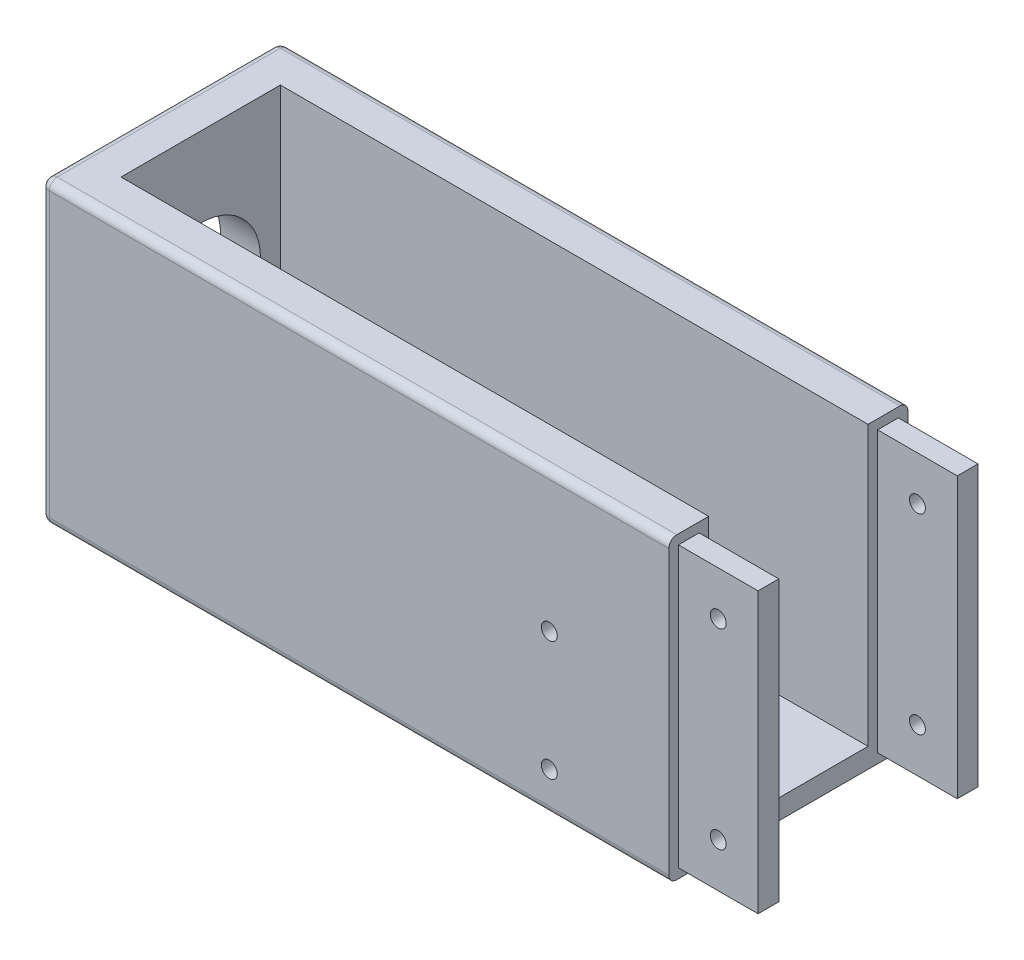
ISO-10303-21;
HEADER;
FILE_DESCRIPTION(('STEP AP214'),'2;1');
FILE_NAME('part.step','',(''),(''),'','','');
FILE_SCHEMA(('AUTOMOTIVE_DESIGN { 1 0 10303 214 1 1 1 1 }'));
ENDSEC;
DATA;
#1=APPLICATION_CONTEXT('core data for automotive mechanical design processes');
#2=APPLICATION_PROTOCOL_DEFINITION('international standard','automotive_design',2000,#1);
#3=PRODUCT_CONTEXT('',#1,'mechanical');
#4=PRODUCT('Part','Part','',(#3));
#5=PRODUCT_RELATED_PRODUCT_CATEGORY('part','',(#4));
#6=PRODUCT_DEFINITION_FORMATION('','',#4);
#7=PRODUCT_DEFINITION_CONTEXT('part definition',#1,'design');
#8=PRODUCT_DEFINITION('design','',#6,#7);
#9=PRODUCT_DEFINITION_SHAPE('','',#8);
#10=(LENGTH_UNIT() NAMED_UNIT(*) SI_UNIT(.MILLI.,.METRE.));
#11=(NAMED_UNIT(*) PLANE_ANGLE_UNIT() SI_UNIT($,.RADIAN.));
#12=(NAMED_UNIT(*) SI_UNIT($,.STERADIAN.) SOLID_ANGLE_UNIT());
#13=UNCERTAINTY_MEASURE_WITH_UNIT(LENGTH_MEASURE(1.E-05),#10,'distance_accuracy_value','');
#14=(GEOMETRIC_REPRESENTATION_CONTEXT(3) GLOBAL_UNCERTAINTY_ASSIGNED_CONTEXT((#13)) GLOBAL_UNIT_ASSIGNED_CONTEXT((#10,
#11,#12)) REPRESENTATION_CONTEXT('',''));
#15=CARTESIAN_POINT('',(0.,0.,0.));
#16=DIRECTION('',(0.,0.,1.));
#17=DIRECTION('',(1.,0.,0.));
#18=AXIS2_PLACEMENT_3D('',#15,#16,#17);
#19=CARTESIAN_POINT('',(0.,0.,0.));
#20=DIRECTION('',(1.,0.,0.));
#21=DIRECTION('',(0.,0.,-1.));
#22=AXIS2_PLACEMENT_3D('',#19,#20,#21);
#23=PLANE('',#22);
#24=DIRECTION('',(0.,1.,0.));
#25=VECTOR('',#24,1.);
#26=CARTESIAN_POINT('',(0.,2.4,-27.6));
#27=LINE('',#26,#25);
#28=CARTESIAN_POINT('',(0.,2.4,-27.6));
#29=VERTEX_POINT('',#28);
#30=CARTESIAN_POINT('',(0.,72.6,-27.6));
#31=VERTEX_POINT('',#30);
#32=EDGE_CURVE('E60',#29,#31,#27,.T.);
#33=ORIENTED_EDGE('',*,*,#32,.F.);
#34=DIRECTION('',(0.,0.,-1.));
#35=VECTOR('',#34,1.);
#36=CARTESIAN_POINT('',(0.,2.4,-22.4));
#37=LINE('',#36,#35);
#38=CARTESIAN_POINT('',(0.,2.4,-22.4));
#39=VERTEX_POINT('',#38);
#40=EDGE_CURVE('E64',#39,#29,#37,.T.);
#41=ORIENTED_EDGE('',*,*,#40,.F.);
#42=DIRECTION('',(0.,-1.,0.));
#43=VECTOR('',#42,1.);
#44=CARTESIAN_POINT('',(0.,72.6,-22.4));
#45=LINE('',#44,#43);
#46=CARTESIAN_POINT('',(0.,72.6,-22.4));
#47=VERTEX_POINT('',#46);
#48=EDGE_CURVE('E394',#47,#39,#45,.T.);
#49=ORIENTED_EDGE('',*,*,#48,.F.);
#50=DIRECTION('',(0.,0.,1.));
#51=VECTOR('',#50,1.);
#52=CARTESIAN_POINT('',(0.,72.6,-27.6));
#53=LINE('',#52,#51);
#54=EDGE_CURVE('E392',#31,#47,#53,.T.);
#55=ORIENTED_EDGE('',*,*,#54,.F.);
#56=EDGE_LOOP('',(#33,#41,#49,#55));
#57=FACE_BOUND('',#56,.T.);
#58=CARTESIAN_POINT('',(0.,73.,-28.));
#59=DIRECTION('',(1.,0.,0.));
#60=DIRECTION('',(0.,0.,-1.));
#61=AXIS2_PLACEMENT_3D('',#58,#59,#60);
#62=CIRCLE('',#61,2.);
#63=CARTESIAN_POINT('',(0.,75.,-28.));
#64=VERTEX_POINT('',#63);
#65=CARTESIAN_POINT('',(0.,73.,-30.));
#66=VERTEX_POINT('',#65);
#67=EDGE_CURVE('E326',#64,#66,#62,.F.);
#68=ORIENTED_EDGE('',*,*,#67,.F.);
#69=DIRECTION('',(0.,0.,1.));
#70=VECTOR('',#69,1.);
#71=CARTESIAN_POINT('',(0.,75.,0.));
#72=LINE('',#71,#70);
#73=CARTESIAN_POINT('',(0.,75.,-20.));
#74=VERTEX_POINT('',#73);
#75=EDGE_CURVE('E341',#64,#74,#72,.T.);
#76=ORIENTED_EDGE('',*,*,#75,.T.);
#77=DIRECTION('',(0.,-1.,0.));
#78=VECTOR('',#77,1.);
#79=CARTESIAN_POINT('',(0.,4.99999999999999,-20.));
#80=LINE('',#79,#78);
#81=CARTESIAN_POINT('',(0.,4.99999999999999,-20.));
#82=VERTEX_POINT('',#81);
#83=EDGE_CURVE('E214',#74,#82,#80,.T.);
#84=ORIENTED_EDGE('',*,*,#83,.T.);
#85=DIRECTION('',(0.,0.,-1.));
#86=VECTOR('',#85,1.);
#87=CARTESIAN_POINT('',(0.,4.99999999999999,0.));
#88=LINE('',#87,#86);
#89=CARTESIAN_POINT('',(0.,4.99999999999999,20.));
#90=VERTEX_POINT('',#89);
#91=EDGE_CURVE('E330',#90,#82,#88,.T.);
#92=ORIENTED_EDGE('',*,*,#91,.F.);
#93=DIRECTION('',(0.,1.,0.));
#94=VECTOR('',#93,1.);
#95=CARTESIAN_POINT('',(0.,4.99999999999999,20.));
#96=LINE('',#95,#94);
#97=CARTESIAN_POINT('',(0.,75.,20.));
#98=VERTEX_POINT('',#97);
#99=EDGE_CURVE('E217',#90,#98,#96,.T.);
#100=ORIENTED_EDGE('',*,*,#99,.T.);
#101=CARTESIAN_POINT('',(0.,75.,28.));
#102=VERTEX_POINT('',#101);
#103=EDGE_CURVE('E342',#98,#102,#72,.T.);
#104=ORIENTED_EDGE('',*,*,#103,.T.);
#105=CARTESIAN_POINT('',(0.,73.,28.));
#106=DIRECTION('',(1.,0.,0.));
#107=DIRECTION('',(0.,0.,-1.));
#108=AXIS2_PLACEMENT_3D('',#105,#106,#107);
#109=CIRCLE('',#108,2.);
#110=CARTESIAN_POINT('',(0.,73.,30.));
#111=VERTEX_POINT('',#110);
#112=EDGE_CURVE('E275',#111,#102,#109,.F.);
#113=ORIENTED_EDGE('',*,*,#112,.F.);
#114=DIRECTION('',(0.,-1.,0.));
#115=VECTOR('',#114,1.);
#116=CARTESIAN_POINT('',(0.,75.,30.));
#117=LINE('',#116,#115);
#118=CARTESIAN_POINT('',(0.,2.,30.));
#119=VERTEX_POINT('',#118);
#120=EDGE_CURVE('E335',#111,#119,#117,.T.);
#121=ORIENTED_EDGE('',*,*,#120,.T.);
#122=CARTESIAN_POINT('',(0.,2.,28.));
#123=DIRECTION('',(1.,0.,0.));
#124=DIRECTION('',(0.,0.,-1.));
#125=AXIS2_PLACEMENT_3D('',#122,#123,#124);
#126=CIRCLE('',#125,2.);
#127=CARTESIAN_POINT('',(0.,0.,28.));
#128=VERTEX_POINT('',#127);
#129=EDGE_CURVE('E324',#128,#119,#126,.F.);
#130=ORIENTED_EDGE('',*,*,#129,.F.);
#131=DIRECTION('',(0.,0.,1.));
#132=VECTOR('',#131,1.);
#133=CARTESIAN_POINT('',(0.,0.,0.));
#134=LINE('',#133,#132);
#135=CARTESIAN_POINT('',(0.,0.,-28.));
#136=VERTEX_POINT('',#135);
#137=EDGE_CURVE('E332',#136,#128,#134,.T.);
#138=ORIENTED_EDGE('',*,*,#137,.F.);
#139=CARTESIAN_POINT('',(0.,2.,-28.));
#140=DIRECTION('',(1.,0.,0.));
#141=DIRECTION('',(0.,0.,-1.));
#142=AXIS2_PLACEMENT_3D('',#139,#140,#141);
#143=CIRCLE('',#142,2.);
#144=CARTESIAN_POINT('',(0.,2.,-30.));
#145=VERTEX_POINT('',#144);
#146=EDGE_CURVE('E328',#145,#136,#143,.F.);
#147=ORIENTED_EDGE('',*,*,#146,.F.);
#148=DIRECTION('',(0.,1.,0.));
#149=VECTOR('',#148,1.);
#150=CARTESIAN_POINT('',(0.,75.,-30.));
#151=LINE('',#150,#149);
#152=EDGE_CURVE('E338',#145,#66,#151,.T.);
#153=ORIENTED_EDGE('',*,*,#152,.T.);
#154=EDGE_LOOP('',(#68,#76,#84,#92,#100,#104,#113,#121,#130,#138,#147,#153));
#155=FACE_BOUND('',#154,.T.);
#156=DIRECTION('',(0.,0.,1.));
#157=VECTOR('',#156,1.);
#158=CARTESIAN_POINT('',(0.,72.6,22.4));
#159=LINE('',#158,#157);
#160=CARTESIAN_POINT('',(0.,72.6,22.4));
#161=VERTEX_POINT('',#160);
#162=CARTESIAN_POINT('',(0.,72.6,27.6));
#163=VERTEX_POINT('',#162);
#164=EDGE_CURVE('E241',#161,#163,#159,.T.);
#165=ORIENTED_EDGE('',*,*,#164,.F.);
#166=DIRECTION('',(0.,1.,0.));
#167=VECTOR('',#166,1.);
#168=CARTESIAN_POINT('',(0.,2.4,22.4));
#169=LINE('',#168,#167);
#170=CARTESIAN_POINT('',(0.,2.4,22.4));
#171=VERTEX_POINT('',#170);
#172=EDGE_CURVE('E243',#171,#161,#169,.T.);
#173=ORIENTED_EDGE('',*,*,#172,.F.);
#174=DIRECTION('',(0.,0.,-1.));
#175=VECTOR('',#174,1.);
#176=CARTESIAN_POINT('',(0.,2.4,27.6));
#177=LINE('',#176,#175);
#178=CARTESIAN_POINT('',(0.,2.4,27.6));
#179=VERTEX_POINT('',#178);
#180=EDGE_CURVE('E235',#179,#171,#177,.T.);
#181=ORIENTED_EDGE('',*,*,#180,.F.);
#182=DIRECTION('',(0.,-1.,0.));
#183=VECTOR('',#182,1.);
#184=CARTESIAN_POINT('',(0.,72.6,27.6));
#185=LINE('',#184,#183);
#186=EDGE_CURVE('E237',#163,#179,#185,.T.);
#187=ORIENTED_EDGE('',*,*,#186,.F.);
#188=EDGE_LOOP('',(#165,#173,#181,#187));
#189=FACE_BOUND('',#188,.T.);
#190=ADVANCED_FACE('F43',(#57,#155,#189),#23,.T.);
#191=CARTESIAN_POINT('',(-157.5,75.,-30.));
#192=DIRECTION('',(1.,0.,0.));
#193=DIRECTION('',(0.,0.,-1.));
#194=AXIS2_PLACEMENT_3D('',#191,#192,#193);
#195=PLANE('',#194);
#196=CARTESIAN_POINT('',(-157.5,40.,0.));
#197=DIRECTION('',(1.,0.,0.));
#198=DIRECTION('',(0.,0.,-1.));
#199=AXIS2_PLACEMENT_3D('',#196,#197,#198);
#200=CIRCLE('',#199,15.);
#201=CARTESIAN_POINT('',(-157.5,40.,-14.9999999999999));
#202=VERTEX_POINT('',#201);
#203=EDGE_CURVE('E909',#202,#202,#200,.T.);
#204=ORIENTED_EDGE('',*,*,#203,.T.);
#205=EDGE_LOOP('',(#204));
#206=FACE_BOUND('',#205,.T.);
#207=DIRECTION('',(0.,0.,1.));
#208=VECTOR('',#207,1.);
#209=CARTESIAN_POINT('',(-157.5,73.,-30.));
#210=LINE('',#209,#208);
#211=CARTESIAN_POINT('',(-157.5,73.,28.));
#212=VERTEX_POINT('',#211);
#213=CARTESIAN_POINT('',(-157.5,73.,-28.));
#214=VERTEX_POINT('',#213);
#215=EDGE_CURVE('E300',#212,#214,#210,.F.);
#216=ORIENTED_EDGE('',*,*,#215,.T.);
#217=DIRECTION('',(0.,-1.,0.));
#218=VECTOR('',#217,1.);
#219=CARTESIAN_POINT('',(-157.5,75.,-28.));
#220=LINE('',#219,#218);
#221=CARTESIAN_POINT('',(-157.5,2.,-28.));
#222=VERTEX_POINT('',#221);
#223=EDGE_CURVE('E272',#214,#222,#220,.T.);
#224=ORIENTED_EDGE('',*,*,#223,.T.);
#225=DIRECTION('',(0.,0.,1.));
#226=VECTOR('',#225,1.);
#227=CARTESIAN_POINT('',(-157.5,2.,30.));
#228=LINE('',#227,#226);
#229=CARTESIAN_POINT('',(-157.5,2.,28.));
#230=VERTEX_POINT('',#229);
#231=EDGE_CURVE('E297',#222,#230,#228,.T.);
#232=ORIENTED_EDGE('',*,*,#231,.T.);
#233=DIRECTION('',(0.,-1.,0.));
#234=VECTOR('',#233,1.);
#235=CARTESIAN_POINT('',(-157.5,75.,28.));
#236=LINE('',#235,#234);
#237=EDGE_CURVE('E274',#230,#212,#236,.F.);
#238=ORIENTED_EDGE('',*,*,#237,.T.);
#239=EDGE_LOOP('',(#216,#224,#232,#238));
#240=FACE_BOUND('',#239,.T.);
#241=ADVANCED_FACE('F405',(#206,#240),#195,.F.);
#242=CARTESIAN_POINT('',(-155.5,75.,28.));
#243=DIRECTION('',(0.,-1.,0.));
#244=DIRECTION('',(0.,0.,-1.));
#245=AXIS2_PLACEMENT_3D('',#242,#243,#244);
#246=CYLINDRICAL_SURFACE('',#245,2.);
#247=CARTESIAN_POINT('',(-155.5,2.,28.));
#248=DIRECTION('',(0.,1.,0.));
#249=DIRECTION('',(0.,0.,1.));
#250=AXIS2_PLACEMENT_3D('',#247,#248,#249);
#251=CIRCLE('',#250,2.);
#252=CARTESIAN_POINT('',(-155.5,2.,30.));
#253=VERTEX_POINT('',#252);
#254=EDGE_CURVE('E256',#230,#253,#251,.T.);
#255=ORIENTED_EDGE('',*,*,#254,.T.);
#256=DIRECTION('',(0.,-1.,0.));
#257=VECTOR('',#256,1.);
#258=CARTESIAN_POINT('',(-155.5,75.,30.));
#259=LINE('',#258,#257);
#260=CARTESIAN_POINT('',(-155.5,73.,30.));
#261=VERTEX_POINT('',#260);
#262=EDGE_CURVE('E278',#261,#253,#259,.T.);
#263=ORIENTED_EDGE('',*,*,#262,.F.);
#264=CARTESIAN_POINT('',(-155.5,73.,28.));
#265=DIRECTION('',(0.,1.,0.));
#266=DIRECTION('',(0.,0.,1.));
#267=AXIS2_PLACEMENT_3D('',#264,#265,#266);
#268=CIRCLE('',#267,2.);
#269=EDGE_CURVE('E11',#212,#261,#268,.T.);
#270=ORIENTED_EDGE('',*,*,#269,.F.);
#271=ORIENTED_EDGE('',*,*,#237,.F.);
#272=EDGE_LOOP('',(#255,#263,#270,#271));
#273=FACE_BOUND('',#272,.T.);
#274=ADVANCED_FACE('F449',(#273),#246,.T.);
#275=CARTESIAN_POINT('',(-155.5,75.,-28.));
#276=DIRECTION('',(0.,-1.,0.));
#277=DIRECTION('',(0.,0.,-1.));
#278=AXIS2_PLACEMENT_3D('',#275,#276,#277);
#279=CYLINDRICAL_SURFACE('',#278,2.);
#280=CARTESIAN_POINT('',(-155.5,2.,-28.));
#281=DIRECTION('',(0.,1.,0.));
#282=DIRECTION('',(0.,0.,1.));
#283=AXIS2_PLACEMENT_3D('',#280,#281,#282);
#284=CIRCLE('',#283,2.);
#285=CARTESIAN_POINT('',(-155.5,2.,-30.));
#286=VERTEX_POINT('',#285);
#287=EDGE_CURVE('E264',#286,#222,#284,.T.);
#288=ORIENTED_EDGE('',*,*,#287,.T.);
#289=ORIENTED_EDGE('',*,*,#223,.F.);
#290=CARTESIAN_POINT('',(-155.5,73.,-28.));
#291=DIRECTION('',(0.,1.,0.));
#292=DIRECTION('',(0.,0.,1.));
#293=AXIS2_PLACEMENT_3D('',#290,#291,#292);
#294=CIRCLE('',#293,2.);
#295=CARTESIAN_POINT('',(-155.5,73.,-30.));
#296=VERTEX_POINT('',#295);
#297=EDGE_CURVE('E268',#296,#214,#294,.T.);
#298=ORIENTED_EDGE('',*,*,#297,.F.);
#299=DIRECTION('',(0.,-1.,0.));
#300=VECTOR('',#299,1.);
#301=CARTESIAN_POINT('',(-155.5,75.,-30.));
#302=LINE('',#301,#300);
#303=EDGE_CURVE('E286',#286,#296,#302,.F.);
#304=ORIENTED_EDGE('',*,*,#303,.F.);
#305=EDGE_LOOP('',(#288,#289,#298,#304));
#306=FACE_BOUND('',#305,.T.);
#307=ADVANCED_FACE('F452',(#306),#279,.T.);
#308=CARTESIAN_POINT('',(-155.5,73.,0.));
#309=DIRECTION('',(0.,0.,1.));
#310=DIRECTION('',(1.,0.,0.));
#311=AXIS2_PLACEMENT_3D('',#308,#309,#310);
#312=CYLINDRICAL_SURFACE('',#311,2.);
#313=DIRECTION('',(0.,0.,1.));
#314=VECTOR('',#313,1.);
#315=CARTESIAN_POINT('',(-155.5,75.,0.));
#316=LINE('',#315,#314);
#317=CARTESIAN_POINT('',(-155.5,75.,-28.));
#318=VERTEX_POINT('',#317);
#319=CARTESIAN_POINT('',(-155.5,75.,28.));
#320=VERTEX_POINT('',#319);
#321=EDGE_CURVE('E303',#318,#320,#316,.T.);
#322=ORIENTED_EDGE('',*,*,#321,.F.);
#323=CARTESIAN_POINT('',(-155.5,73.,-28.));
#324=DIRECTION('',(0.,0.,1.));
#325=DIRECTION('',(1.,0.,0.));
#326=AXIS2_PLACEMENT_3D('',#323,#324,#325);
#327=CIRCLE('',#326,2.);
#328=EDGE_CURVE('E290',#318,#214,#327,.T.);
#329=ORIENTED_EDGE('',*,*,#328,.T.);
#330=ORIENTED_EDGE('',*,*,#215,.F.);
#331=CARTESIAN_POINT('',(-155.5,73.,28.));
#332=DIRECTION('',(0.,0.,1.));
#333=DIRECTION('',(1.,0.,0.));
#334=AXIS2_PLACEMENT_3D('',#331,#332,#333);
#335=CIRCLE('',#334,2.);
#336=EDGE_CURVE('E293',#212,#320,#335,.F.);
#337=ORIENTED_EDGE('',*,*,#336,.T.);
#338=EDGE_LOOP('',(#322,#329,#330,#337));
#339=FACE_BOUND('',#338,.T.);
#340=ADVANCED_FACE('F466',(#339),#312,.T.);
#341=CARTESIAN_POINT('',(-155.5,2.,-30.));
#342=DIRECTION('',(0.,0.,-1.));
#343=DIRECTION('',(-1.,0.,0.));
#344=AXIS2_PLACEMENT_3D('',#341,#342,#343);
#345=CYLINDRICAL_SURFACE('',#344,2.);
#346=ORIENTED_EDGE('',*,*,#231,.F.);
#347=CARTESIAN_POINT('',(-155.5,2.,-28.));
#348=DIRECTION('',(0.,0.,-1.));
#349=DIRECTION('',(-1.,0.,0.));
#350=AXIS2_PLACEMENT_3D('',#347,#348,#349);
#351=CIRCLE('',#350,2.);
#352=CARTESIAN_POINT('',(-155.5,0.,-28.));
#353=VERTEX_POINT('',#352);
#354=EDGE_CURVE('E280',#222,#353,#351,.F.);
#355=ORIENTED_EDGE('',*,*,#354,.T.);
#356=DIRECTION('',(0.,0.,1.));
#357=VECTOR('',#356,1.);
#358=CARTESIAN_POINT('',(-155.5,0.,-30.));
#359=LINE('',#358,#357);
#360=CARTESIAN_POINT('',(-155.5,0.,28.));
#361=VERTEX_POINT('',#360);
#362=EDGE_CURVE('E306',#361,#353,#359,.F.);
#363=ORIENTED_EDGE('',*,*,#362,.F.);
#364=CARTESIAN_POINT('',(-155.5,2.,28.));
#365=DIRECTION('',(0.,0.,-1.));
#366=DIRECTION('',(-1.,0.,0.));
#367=AXIS2_PLACEMENT_3D('',#364,#365,#366);
#368=CIRCLE('',#367,2.);
#369=EDGE_CURVE('E283',#361,#230,#368,.T.);
#370=ORIENTED_EDGE('',*,*,#369,.T.);
#371=EDGE_LOOP('',(#346,#355,#363,#370));
#372=FACE_BOUND('',#371,.T.);
#373=ADVANCED_FACE('F462',(#372),#345,.T.);
#374=CARTESIAN_POINT('',(-155.5,2.,-28.));
#375=DIRECTION('',(0.,0.,1.));
#376=DIRECTION('',(1.,0.,0.));
#377=AXIS2_PLACEMENT_3D('',#374,#375,#376);
#378=SPHERICAL_SURFACE('',#377,2.);
#379=CARTESIAN_POINT('',(-155.5,2.,-28.));
#380=DIRECTION('',(-1.,0.,0.));
#381=DIRECTION('',(0.,0.,1.));
#382=AXIS2_PLACEMENT_3D('',#379,#380,#381);
#383=CIRCLE('',#382,2.);
#384=EDGE_CURVE('E261',#286,#353,#383,.T.);
#385=ORIENTED_EDGE('',*,*,#384,.T.);
#386=ORIENTED_EDGE('',*,*,#354,.F.);
#387=ORIENTED_EDGE('',*,*,#287,.F.);
#388=EDGE_LOOP('',(#385,#386,#387));
#389=FACE_BOUND('',#388,.T.);
#390=ADVANCED_FACE('F458',(#389),#378,.T.);
#391=CARTESIAN_POINT('',(-155.5,73.,-28.));
#392=DIRECTION('',(0.,0.,1.));
#393=DIRECTION('',(1.,0.,0.));
#394=AXIS2_PLACEMENT_3D('',#391,#392,#393);
#395=SPHERICAL_SURFACE('',#394,2.);
#396=ORIENTED_EDGE('',*,*,#297,.T.);
#397=ORIENTED_EDGE('',*,*,#328,.F.);
#398=CARTESIAN_POINT('',(-155.5,73.,-28.));
#399=DIRECTION('',(-1.,0.,0.));
#400=DIRECTION('',(0.,0.,1.));
#401=AXIS2_PLACEMENT_3D('',#398,#399,#400);
#402=CIRCLE('',#401,2.);
#403=EDGE_CURVE('E257',#318,#296,#402,.T.);
#404=ORIENTED_EDGE('',*,*,#403,.T.);
#405=EDGE_LOOP('',(#396,#397,#404));
#406=FACE_BOUND('',#405,.T.);
#407=ADVANCED_FACE('F461',(#406),#395,.T.);
#408=CARTESIAN_POINT('',(157.5,75.,-30.));
#409=DIRECTION('',(0.,0.,1.));
#410=DIRECTION('',(1.,0.,0.));
#411=AXIS2_PLACEMENT_3D('',#408,#409,#410);
#412=PLANE('',#411);
#413=ORIENTED_EDGE('',*,*,#152,.F.);
#414=DIRECTION('',(-1.,0.,0.));
#415=VECTOR('',#414,1.);
#416=CARTESIAN_POINT('',(-155.5,2.,-30.));
#417=LINE('',#416,#415);
#418=EDGE_CURVE('E289',#145,#286,#417,.T.);
#419=ORIENTED_EDGE('',*,*,#418,.T.);
#420=ORIENTED_EDGE('',*,*,#303,.T.);
#421=DIRECTION('',(-1.,0.,0.));
#422=VECTOR('',#421,1.);
#423=CARTESIAN_POINT('',(157.5,73.,-30.));
#424=LINE('',#423,#422);
#425=EDGE_CURVE('E354',#296,#66,#424,.F.);
#426=ORIENTED_EDGE('',*,*,#425,.T.);
#427=EDGE_LOOP('',(#413,#419,#420,#426));
#428=FACE_BOUND('',#427,.T.);
#429=ADVANCED_FACE('F447',(#428),#412,.F.);
#430=CARTESIAN_POINT('',(-155.5,2.,28.));
#431=DIRECTION('',(0.,0.,-1.));
#432=DIRECTION('',(-1.,0.,0.));
#433=AXIS2_PLACEMENT_3D('',#430,#431,#432);
#434=SPHERICAL_SURFACE('',#433,2.);
#435=ORIENTED_EDGE('',*,*,#369,.F.);
#436=CARTESIAN_POINT('',(-155.5,2.,28.));
#437=DIRECTION('',(-1.,0.,0.));
#438=DIRECTION('',(0.,0.,1.));
#439=AXIS2_PLACEMENT_3D('',#436,#437,#438);
#440=CIRCLE('',#439,2.);
#441=EDGE_CURVE('E253',#361,#253,#440,.T.);
#442=ORIENTED_EDGE('',*,*,#441,.T.);
#443=ORIENTED_EDGE('',*,*,#254,.F.);
#444=EDGE_LOOP('',(#435,#442,#443));
#445=FACE_BOUND('',#444,.T.);
#446=ADVANCED_FACE('F443',(#445),#434,.T.);
#447=CARTESIAN_POINT('',(-155.5,73.,28.));
#448=DIRECTION('',(0.,0.,-1.));
#449=DIRECTION('',(-1.,0.,0.));
#450=AXIS2_PLACEMENT_3D('',#447,#448,#449);
#451=SPHERICAL_SURFACE('',#450,2.);
#452=CARTESIAN_POINT('',(-155.5,73.,28.));
#453=DIRECTION('',(-1.,0.,0.));
#454=DIRECTION('',(0.,0.,1.));
#455=AXIS2_PLACEMENT_3D('',#452,#453,#454);
#456=CIRCLE('',#455,2.);
#457=EDGE_CURVE('E52',#261,#320,#456,.T.);
#458=ORIENTED_EDGE('',*,*,#457,.T.);
#459=ORIENTED_EDGE('',*,*,#336,.F.);
#460=ORIENTED_EDGE('',*,*,#269,.T.);
#461=EDGE_LOOP('',(#458,#459,#460));
#462=FACE_BOUND('',#461,.T.);
#463=ADVANCED_FACE('F446',(#462),#451,.T.);
#464=CARTESIAN_POINT('',(0.,75.,0.));
#465=DIRECTION('',(0.,-1.,0.));
#466=DIRECTION('',(0.,0.,-1.));
#467=AXIS2_PLACEMENT_3D('',#464,#465,#466);
#468=PLANE('',#467);
#469=ORIENTED_EDGE('',*,*,#75,.F.);
#470=DIRECTION('',(-1.,0.,0.));
#471=VECTOR('',#470,1.);
#472=CARTESIAN_POINT('',(0.,75.,-28.));
#473=LINE('',#472,#471);
#474=EDGE_CURVE('E288',#64,#318,#473,.T.);
#475=ORIENTED_EDGE('',*,*,#474,.T.);
#476=ORIENTED_EDGE('',*,*,#321,.T.);
#477=DIRECTION('',(1.,0.,0.));
#478=VECTOR('',#477,1.);
#479=CARTESIAN_POINT('',(0.,75.,28.));
#480=LINE('',#479,#478);
#481=EDGE_CURVE('E294',#320,#102,#480,.T.);
#482=ORIENTED_EDGE('',*,*,#481,.T.);
#483=ORIENTED_EDGE('',*,*,#103,.F.);
#484=DIRECTION('',(1.,0.,0.));
#485=VECTOR('',#484,1.);
#486=CARTESIAN_POINT('',(-147.5,75.,20.));
#487=LINE('',#486,#485);
#488=CARTESIAN_POINT('',(-147.5,75.,20.));
#489=VERTEX_POINT('',#488);
#490=EDGE_CURVE('E318',#489,#98,#487,.T.);
#491=ORIENTED_EDGE('',*,*,#490,.F.);
#492=DIRECTION('',(0.,0.,1.));
#493=VECTOR('',#492,1.);
#494=CARTESIAN_POINT('',(-147.5,75.,-20.));
#495=LINE('',#494,#493);
#496=CARTESIAN_POINT('',(-147.5,75.,-20.));
#497=VERTEX_POINT('',#496);
#498=EDGE_CURVE('E315',#497,#489,#495,.T.);
#499=ORIENTED_EDGE('',*,*,#498,.F.);
#500=DIRECTION('',(-1.,0.,0.));
#501=VECTOR('',#500,1.);
#502=CARTESIAN_POINT('',(-147.5,75.,-20.));
#503=LINE('',#502,#501);
#504=EDGE_CURVE('E265',#74,#497,#503,.T.);
#505=ORIENTED_EDGE('',*,*,#504,.F.);
#506=EDGE_LOOP('',(#469,#475,#476,#482,#483,#491,#499,#505));
#507=FACE_BOUND('',#506,.T.);
#508=ADVANCED_FACE('F456',(#507),#468,.F.);
#509=CARTESIAN_POINT('',(157.5,75.,30.));
#510=DIRECTION('',(0.,0.,-1.));
#511=DIRECTION('',(-1.,0.,0.));
#512=AXIS2_PLACEMENT_3D('',#509,#510,#511);
#513=PLANE('',#512);
#514=CARTESIAN_POINT('',(-30.,10.,30.));
#515=DIRECTION('',(0.,0.,1.));
#516=DIRECTION('',(1.,0.,0.));
#517=AXIS2_PLACEMENT_3D('',#514,#515,#516);
#518=CIRCLE('',#517,2.);
#519=CARTESIAN_POINT('',(-28.,10.,30.));
#520=VERTEX_POINT('',#519);
#521=EDGE_CURVE('E904',#520,#520,#518,.T.);
#522=ORIENTED_EDGE('',*,*,#521,.F.);
#523=EDGE_LOOP('',(#522));
#524=FACE_BOUND('',#523,.T.);
#525=CARTESIAN_POINT('',(-30.,40.,30.));
#526=DIRECTION('',(0.,0.,1.));
#527=DIRECTION('',(1.,0.,0.));
#528=AXIS2_PLACEMENT_3D('',#525,#526,#527);
#529=CIRCLE('',#528,2.);
#530=CARTESIAN_POINT('',(-28.,40.,30.));
#531=VERTEX_POINT('',#530);
#532=EDGE_CURVE('E901',#531,#531,#529,.T.);
#533=ORIENTED_EDGE('',*,*,#532,.F.);
#534=EDGE_LOOP('',(#533));
#535=FACE_BOUND('',#534,.T.);
#536=ORIENTED_EDGE('',*,*,#120,.F.);
#537=DIRECTION('',(1.,0.,0.));
#538=VECTOR('',#537,1.);
#539=CARTESIAN_POINT('',(157.5,73.,30.));
#540=LINE('',#539,#538);
#541=EDGE_CURVE('E277',#111,#261,#540,.F.);
#542=ORIENTED_EDGE('',*,*,#541,.T.);
#543=ORIENTED_EDGE('',*,*,#262,.T.);
#544=DIRECTION('',(1.,0.,0.));
#545=VECTOR('',#544,1.);
#546=CARTESIAN_POINT('',(155.5,2.,30.));
#547=LINE('',#546,#545);
#548=EDGE_CURVE('E281',#253,#119,#547,.T.);
#549=ORIENTED_EDGE('',*,*,#548,.T.);
#550=EDGE_LOOP('',(#536,#542,#543,#549));
#551=FACE_BOUND('',#550,.T.);
#552=ADVANCED_FACE('F486',(#524,#535,#551),#513,.F.);
#553=CARTESIAN_POINT('',(0.,73.,28.));
#554=DIRECTION('',(1.,0.,0.));
#555=DIRECTION('',(0.,0.,-1.));
#556=AXIS2_PLACEMENT_3D('',#553,#554,#555);
#557=CYLINDRICAL_SURFACE('',#556,2.);
#558=ORIENTED_EDGE('',*,*,#541,.F.);
#559=ORIENTED_EDGE('',*,*,#112,.T.);
#560=ORIENTED_EDGE('',*,*,#481,.F.);
#561=ORIENTED_EDGE('',*,*,#457,.F.);
#562=EDGE_LOOP('',(#558,#559,#560,#561));
#563=FACE_BOUND('',#562,.T.);
#564=ADVANCED_FACE('F45',(#563),#557,.T.);
#565=CARTESIAN_POINT('',(0.,0.,0.));
#566=DIRECTION('',(0.,-1.,0.));
#567=DIRECTION('',(0.,0.,-1.));
#568=AXIS2_PLACEMENT_3D('',#565,#566,#567);
#569=PLANE('',#568);
#570=CARTESIAN_POINT('',(-137.5,0.,15.));
#571=DIRECTION('',(0.,1.,0.));
#572=DIRECTION('',(0.,0.,1.));
#573=AXIS2_PLACEMENT_3D('',#570,#571,#572);
#574=CIRCLE('',#573,2.);
#575=CARTESIAN_POINT('',(-137.5,0.,17.));
#576=VERTEX_POINT('',#575);
#577=EDGE_CURVE('E886',#576,#576,#574,.T.);
#578=ORIENTED_EDGE('',*,*,#577,.T.);
#579=EDGE_LOOP('',(#578));
#580=FACE_BOUND('',#579,.T.);
#581=CARTESIAN_POINT('',(-137.5,0.,-15.));
#582=DIRECTION('',(0.,1.,0.));
#583=DIRECTION('',(0.,0.,-1.));
#584=AXIS2_PLACEMENT_3D('',#581,#582,#583);
#585=CIRCLE('',#584,2.);
#586=CARTESIAN_POINT('',(-137.5,0.,-17.));
#587=VERTEX_POINT('',#586);
#588=EDGE_CURVE('E889',#587,#587,#585,.T.);
#589=ORIENTED_EDGE('',*,*,#588,.T.);
#590=EDGE_LOOP('',(#589));
#591=FACE_BOUND('',#590,.T.);
#592=DIRECTION('',(-1.,0.,0.));
#593=VECTOR('',#592,1.);
#594=CARTESIAN_POINT('',(155.5,0.,-28.));
#595=LINE('',#594,#593);
#596=EDGE_CURVE('E285',#353,#136,#595,.F.);
#597=ORIENTED_EDGE('',*,*,#596,.T.);
#598=ORIENTED_EDGE('',*,*,#137,.T.);
#599=DIRECTION('',(1.,0.,0.));
#600=VECTOR('',#599,1.);
#601=CARTESIAN_POINT('',(-155.5,0.,28.));
#602=LINE('',#601,#600);
#603=EDGE_CURVE('E352',#128,#361,#602,.F.);
#604=ORIENTED_EDGE('',*,*,#603,.T.);
#605=ORIENTED_EDGE('',*,*,#362,.T.);
#606=EDGE_LOOP('',(#597,#598,#604,#605));
#607=FACE_BOUND('',#606,.T.);
#608=ADVANCED_FACE('F496',(#580,#591,#607),#569,.T.);
#609=CARTESIAN_POINT('',(157.5,2.,28.));
#610=DIRECTION('',(-1.,0.,0.));
#611=DIRECTION('',(0.,0.,1.));
#612=AXIS2_PLACEMENT_3D('',#609,#610,#611);
#613=CYLINDRICAL_SURFACE('',#612,2.);
#614=ORIENTED_EDGE('',*,*,#603,.F.);
#615=ORIENTED_EDGE('',*,*,#129,.T.);
#616=ORIENTED_EDGE('',*,*,#548,.F.);
#617=ORIENTED_EDGE('',*,*,#441,.F.);
#618=EDGE_LOOP('',(#614,#615,#616,#617));
#619=FACE_BOUND('',#618,.T.);
#620=ADVANCED_FACE('F499',(#619),#613,.T.);
#621=CARTESIAN_POINT('',(0.,73.,-28.));
#622=DIRECTION('',(-1.,0.,0.));
#623=DIRECTION('',(0.,0.,1.));
#624=AXIS2_PLACEMENT_3D('',#621,#622,#623);
#625=CYLINDRICAL_SURFACE('',#624,2.);
#626=ORIENTED_EDGE('',*,*,#474,.F.);
#627=ORIENTED_EDGE('',*,*,#67,.T.);
#628=ORIENTED_EDGE('',*,*,#425,.F.);
#629=ORIENTED_EDGE('',*,*,#403,.F.);
#630=EDGE_LOOP('',(#626,#627,#628,#629));
#631=FACE_BOUND('',#630,.T.);
#632=ADVANCED_FACE('F514',(#631),#625,.T.);
#633=CARTESIAN_POINT('',(157.5,2.,-28.));
#634=DIRECTION('',(1.,0.,0.));
#635=DIRECTION('',(0.,0.,-1.));
#636=AXIS2_PLACEMENT_3D('',#633,#634,#635);
#637=CYLINDRICAL_SURFACE('',#636,2.);
#638=ORIENTED_EDGE('',*,*,#418,.F.);
#639=ORIENTED_EDGE('',*,*,#146,.T.);
#640=ORIENTED_EDGE('',*,*,#596,.F.);
#641=ORIENTED_EDGE('',*,*,#384,.F.);
#642=EDGE_LOOP('',(#638,#639,#640,#641));
#643=FACE_BOUND('',#642,.T.);
#644=ADVANCED_FACE('F483',(#643),#637,.T.);
#645=CARTESIAN_POINT('',(-147.5,4.99999999999999,-20.));
#646=DIRECTION('',(-1.,0.,0.));
#647=DIRECTION('',(0.,0.,1.));
#648=AXIS2_PLACEMENT_3D('',#645,#646,#647);
#649=PLANE('',#648);
#650=CARTESIAN_POINT('',(-147.5,40.,0.));
#651=DIRECTION('',(-1.,0.,0.));
#652=DIRECTION('',(0.,0.,1.));
#653=AXIS2_PLACEMENT_3D('',#650,#651,#652);
#654=CIRCLE('',#653,15.);
#655=CARTESIAN_POINT('',(-147.5,40.,15.0000000000001));
#656=VERTEX_POINT('',#655);
#657=EDGE_CURVE('E47',#656,#656,#654,.T.);
#658=ORIENTED_EDGE('',*,*,#657,.T.);
#659=EDGE_LOOP('',(#658));
#660=FACE_BOUND('',#659,.T.);
#661=ORIENTED_EDGE('',*,*,#498,.T.);
#662=DIRECTION('',(0.,1.,0.));
#663=VECTOR('',#662,1.);
#664=CARTESIAN_POINT('',(-147.5,4.99999999999999,20.));
#665=LINE('',#664,#663);
#666=CARTESIAN_POINT('',(-147.5,4.99999999999999,20.));
#667=VERTEX_POINT('',#666);
#668=EDGE_CURVE('E309',#667,#489,#665,.T.);
#669=ORIENTED_EDGE('',*,*,#668,.F.);
#670=DIRECTION('',(0.,0.,1.));
#671=VECTOR('',#670,1.);
#672=CARTESIAN_POINT('',(-147.5,4.99999999999999,-20.));
#673=LINE('',#672,#671);
#674=CARTESIAN_POINT('',(-147.5,4.99999999999999,-20.));
#675=VERTEX_POINT('',#674);
#676=EDGE_CURVE('E319',#675,#667,#673,.T.);
#677=ORIENTED_EDGE('',*,*,#676,.F.);
#678=DIRECTION('',(0.,1.,0.));
#679=VECTOR('',#678,1.);
#680=CARTESIAN_POINT('',(-147.5,4.99999999999999,-20.));
#681=LINE('',#680,#679);
#682=EDGE_CURVE('E310',#675,#497,#681,.T.);
#683=ORIENTED_EDGE('',*,*,#682,.T.);
#684=EDGE_LOOP('',(#661,#669,#677,#683));
#685=FACE_BOUND('',#684,.T.);
#686=ADVANCED_FACE('F480',(#660,#685),#649,.F.);
#687=CARTESIAN_POINT('',(-147.5,4.99999999999999,-20.));
#688=DIRECTION('',(0.,0.,-1.));
#689=DIRECTION('',(-1.,0.,0.));
#690=AXIS2_PLACEMENT_3D('',#687,#688,#689);
#691=PLANE('',#690);
#692=ORIENTED_EDGE('',*,*,#83,.F.);
#693=ORIENTED_EDGE('',*,*,#504,.T.);
#694=ORIENTED_EDGE('',*,*,#682,.F.);
#695=DIRECTION('',(-1.,0.,0.));
#696=VECTOR('',#695,1.);
#697=CARTESIAN_POINT('',(-147.5,4.99999999999999,-20.));
#698=LINE('',#697,#696);
#699=EDGE_CURVE('E322',#82,#675,#698,.T.);
#700=ORIENTED_EDGE('',*,*,#699,.F.);
#701=EDGE_LOOP('',(#692,#693,#694,#700));
#702=FACE_BOUND('',#701,.T.);
#703=ADVANCED_FACE('F482',(#702),#691,.F.);
#704=CARTESIAN_POINT('',(-147.5,4.99999999999999,20.));
#705=DIRECTION('',(0.,0.,1.));
#706=DIRECTION('',(1.,0.,0.));
#707=AXIS2_PLACEMENT_3D('',#704,#705,#706);
#708=PLANE('',#707);
#709=CARTESIAN_POINT('',(-30.,10.,20.));
#710=DIRECTION('',(0.,0.,1.));
#711=DIRECTION('',(1.,0.,0.));
#712=AXIS2_PLACEMENT_3D('',#709,#710,#711);
#713=CIRCLE('',#712,2.);
#714=CARTESIAN_POINT('',(-28.,10.,20.));
#715=VERTEX_POINT('',#714);
#716=EDGE_CURVE('E893',#715,#715,#713,.T.);
#717=ORIENTED_EDGE('',*,*,#716,.T.);
#718=EDGE_LOOP('',(#717));
#719=FACE_BOUND('',#718,.T.);
#720=CARTESIAN_POINT('',(-30.,40.,20.));
#721=DIRECTION('',(0.,0.,1.));
#722=DIRECTION('',(1.,0.,0.));
#723=AXIS2_PLACEMENT_3D('',#720,#721,#722);
#724=CIRCLE('',#723,2.);
#725=CARTESIAN_POINT('',(-28.,40.,20.));
#726=VERTEX_POINT('',#725);
#727=EDGE_CURVE('E898',#726,#726,#724,.T.);
#728=ORIENTED_EDGE('',*,*,#727,.T.);
#729=EDGE_LOOP('',(#728));
#730=FACE_BOUND('',#729,.T.);
#731=ORIENTED_EDGE('',*,*,#99,.F.);
#732=DIRECTION('',(1.,0.,0.));
#733=VECTOR('',#732,1.);
#734=CARTESIAN_POINT('',(-147.5,4.99999999999999,20.));
#735=LINE('',#734,#733);
#736=EDGE_CURVE('E313',#667,#90,#735,.T.);
#737=ORIENTED_EDGE('',*,*,#736,.F.);
#738=ORIENTED_EDGE('',*,*,#668,.T.);
#739=ORIENTED_EDGE('',*,*,#490,.T.);
#740=EDGE_LOOP('',(#731,#737,#738,#739));
#741=FACE_BOUND('',#740,.T.);
#742=ADVANCED_FACE('F501',(#719,#730,#741),#708,.F.);
#743=CARTESIAN_POINT('',(0.,4.99999999999999,0.));
#744=DIRECTION('',(0.,1.,0.));
#745=DIRECTION('',(0.,0.,1.));
#746=AXIS2_PLACEMENT_3D('',#743,#744,#745);
#747=PLANE('',#746);
#748=CARTESIAN_POINT('',(-137.5,4.99999999999999,15.));
#749=DIRECTION('',(0.,1.,0.));
#750=DIRECTION('',(0.,0.,1.));
#751=AXIS2_PLACEMENT_3D('',#748,#749,#750);
#752=CIRCLE('',#751,2.);
#753=CARTESIAN_POINT('',(-137.5,4.99999999999999,17.));
#754=VERTEX_POINT('',#753);
#755=EDGE_CURVE('E882',#754,#754,#752,.T.);
#756=ORIENTED_EDGE('',*,*,#755,.F.);
#757=EDGE_LOOP('',(#756));
#758=FACE_BOUND('',#757,.T.);
#759=CARTESIAN_POINT('',(-137.5,4.99999999999999,-15.));
#760=DIRECTION('',(0.,1.,0.));
#761=DIRECTION('',(0.,0.,-1.));
#762=AXIS2_PLACEMENT_3D('',#759,#760,#761);
#763=CIRCLE('',#762,2.);
#764=CARTESIAN_POINT('',(-137.5,4.99999999999999,-17.));
#765=VERTEX_POINT('',#764);
#766=EDGE_CURVE('E892',#765,#765,#763,.T.);
#767=ORIENTED_EDGE('',*,*,#766,.F.);
#768=EDGE_LOOP('',(#767));
#769=FACE_BOUND('',#768,.T.);
#770=ORIENTED_EDGE('',*,*,#736,.T.);
#771=ORIENTED_EDGE('',*,*,#91,.T.);
#772=ORIENTED_EDGE('',*,*,#699,.T.);
#773=ORIENTED_EDGE('',*,*,#676,.T.);
#774=EDGE_LOOP('',(#770,#771,#772,#773));
#775=FACE_BOUND('',#774,.T.);
#776=ADVANCED_FACE('F504',(#758,#769,#775),#747,.T.);
#777=CARTESIAN_POINT('',(20.,2.4,22.4));
#778=DIRECTION('',(0.,0.,1.));
#779=DIRECTION('',(1.,0.,0.));
#780=AXIS2_PLACEMENT_3D('',#777,#778,#779);
#781=PLANE('',#780);
#782=CARTESIAN_POINT('',(10.,61.5,22.4));
#783=DIRECTION('',(0.,0.,1.));
#784=DIRECTION('',(1.,0.,0.));
#785=AXIS2_PLACEMENT_3D('',#782,#783,#784);
#786=CIRCLE('',#785,2.);
#787=CARTESIAN_POINT('',(12.,61.5,22.4));
#788=VERTEX_POINT('',#787);
#789=EDGE_CURVE('E226',#788,#788,#786,.T.);
#790=ORIENTED_EDGE('',*,*,#789,.T.);
#791=EDGE_LOOP('',(#790));
#792=FACE_BOUND('',#791,.T.);
#793=CARTESIAN_POINT('',(10.,13.5,22.4));
#794=DIRECTION('',(0.,0.,1.));
#795=DIRECTION('',(1.,0.,0.));
#796=AXIS2_PLACEMENT_3D('',#793,#794,#795);
#797=CIRCLE('',#796,2.);
#798=CARTESIAN_POINT('',(12.,13.5,22.4));
#799=VERTEX_POINT('',#798);
#800=EDGE_CURVE('E373',#799,#799,#797,.T.);
#801=ORIENTED_EDGE('',*,*,#800,.T.);
#802=EDGE_LOOP('',(#801));
#803=FACE_BOUND('',#802,.T.);
#804=ORIENTED_EDGE('',*,*,#172,.T.);
#805=DIRECTION('',(-1.,0.,0.));
#806=VECTOR('',#805,1.);
#807=CARTESIAN_POINT('',(20.,72.6,22.4));
#808=LINE('',#807,#806);
#809=CARTESIAN_POINT('',(20.,72.6,22.4));
#810=VERTEX_POINT('',#809);
#811=EDGE_CURVE('E223',#810,#161,#808,.T.);
#812=ORIENTED_EDGE('',*,*,#811,.F.);
#813=DIRECTION('',(0.,1.,0.));
#814=VECTOR('',#813,1.);
#815=CARTESIAN_POINT('',(20.,2.4,22.4));
#816=LINE('',#815,#814);
#817=CARTESIAN_POINT('',(20.,2.4,22.4));
#818=VERTEX_POINT('',#817);
#819=EDGE_CURVE('E238',#818,#810,#816,.T.);
#820=ORIENTED_EDGE('',*,*,#819,.F.);
#821=DIRECTION('',(-1.,0.,0.));
#822=VECTOR('',#821,1.);
#823=CARTESIAN_POINT('',(20.,2.4,22.4));
#824=LINE('',#823,#822);
#825=EDGE_CURVE('E231',#818,#171,#824,.T.);
#826=ORIENTED_EDGE('',*,*,#825,.T.);
#827=EDGE_LOOP('',(#804,#812,#820,#826));
#828=FACE_BOUND('',#827,.T.);
#829=ADVANCED_FACE('F428',(#792,#803,#828),#781,.F.);
#830=CARTESIAN_POINT('',(20.,72.6,22.4));
#831=DIRECTION('',(0.,-1.,0.));
#832=DIRECTION('',(0.,0.,-1.));
#833=AXIS2_PLACEMENT_3D('',#830,#831,#832);
#834=PLANE('',#833);
#835=ORIENTED_EDGE('',*,*,#164,.T.);
#836=DIRECTION('',(-1.,0.,0.));
#837=VECTOR('',#836,1.);
#838=CARTESIAN_POINT('',(20.,72.6,27.6));
#839=LINE('',#838,#837);
#840=CARTESIAN_POINT('',(20.,72.6,27.6));
#841=VERTEX_POINT('',#840);
#842=EDGE_CURVE('E225',#841,#163,#839,.T.);
#843=ORIENTED_EDGE('',*,*,#842,.F.);
#844=DIRECTION('',(0.,0.,1.));
#845=VECTOR('',#844,1.);
#846=CARTESIAN_POINT('',(20.,72.6,22.4));
#847=LINE('',#846,#845);
#848=EDGE_CURVE('E249',#810,#841,#847,.T.);
#849=ORIENTED_EDGE('',*,*,#848,.F.);
#850=ORIENTED_EDGE('',*,*,#811,.T.);
#851=EDGE_LOOP('',(#835,#843,#849,#850));
#852=FACE_BOUND('',#851,.T.);
#853=ADVANCED_FACE('F416',(#852),#834,.F.);
#854=CARTESIAN_POINT('',(20.,72.6,27.6));
#855=DIRECTION('',(0.,0.,-1.));
#856=DIRECTION('',(-1.,0.,0.));
#857=AXIS2_PLACEMENT_3D('',#854,#855,#856);
#858=PLANE('',#857);
#859=CARTESIAN_POINT('',(10.,61.5,27.6));
#860=DIRECTION('',(0.,0.,1.));
#861=DIRECTION('',(1.,0.,0.));
#862=AXIS2_PLACEMENT_3D('',#859,#860,#861);
#863=CIRCLE('',#862,2.);
#864=CARTESIAN_POINT('',(12.,61.5,27.6));
#865=VERTEX_POINT('',#864);
#866=EDGE_CURVE('E369',#865,#865,#863,.T.);
#867=ORIENTED_EDGE('',*,*,#866,.F.);
#868=EDGE_LOOP('',(#867));
#869=FACE_BOUND('',#868,.T.);
#870=CARTESIAN_POINT('',(10.,13.5,27.6));
#871=DIRECTION('',(0.,0.,1.));
#872=DIRECTION('',(-1.,0.,0.));
#873=AXIS2_PLACEMENT_3D('',#870,#871,#872);
#874=CIRCLE('',#873,2.);
#875=CARTESIAN_POINT('',(8.,13.5,27.6));
#876=VERTEX_POINT('',#875);
#877=EDGE_CURVE('E880',#876,#876,#874,.T.);
#878=ORIENTED_EDGE('',*,*,#877,.F.);
#879=EDGE_LOOP('',(#878));
#880=FACE_BOUND('',#879,.T.);
#881=ORIENTED_EDGE('',*,*,#186,.T.);
#882=DIRECTION('',(-1.,0.,0.));
#883=VECTOR('',#882,1.);
#884=CARTESIAN_POINT('',(20.,2.4,27.6));
#885=LINE('',#884,#883);
#886=CARTESIAN_POINT('',(20.,2.4,27.6));
#887=VERTEX_POINT('',#886);
#888=EDGE_CURVE('E229',#887,#179,#885,.T.);
#889=ORIENTED_EDGE('',*,*,#888,.F.);
#890=DIRECTION('',(0.,-1.,0.));
#891=VECTOR('',#890,1.);
#892=CARTESIAN_POINT('',(20.,72.6,27.6));
#893=LINE('',#892,#891);
#894=EDGE_CURVE('E247',#841,#887,#893,.T.);
#895=ORIENTED_EDGE('',*,*,#894,.F.);
#896=ORIENTED_EDGE('',*,*,#842,.T.);
#897=EDGE_LOOP('',(#881,#889,#895,#896));
#898=FACE_BOUND('',#897,.T.);
#899=ADVANCED_FACE('F420',(#869,#880,#898),#858,.F.);
#900=CARTESIAN_POINT('',(20.,2.4,27.6));
#901=DIRECTION('',(0.,1.,0.));
#902=DIRECTION('',(0.,0.,1.));
#903=AXIS2_PLACEMENT_3D('',#900,#901,#902);
#904=PLANE('',#903);
#905=ORIENTED_EDGE('',*,*,#180,.T.);
#906=ORIENTED_EDGE('',*,*,#825,.F.);
#907=DIRECTION('',(0.,0.,-1.));
#908=VECTOR('',#907,1.);
#909=CARTESIAN_POINT('',(20.,2.4,27.6));
#910=LINE('',#909,#908);
#911=EDGE_CURVE('E234',#887,#818,#910,.T.);
#912=ORIENTED_EDGE('',*,*,#911,.F.);
#913=ORIENTED_EDGE('',*,*,#888,.T.);
#914=EDGE_LOOP('',(#905,#906,#912,#913));
#915=FACE_BOUND('',#914,.T.);
#916=ADVANCED_FACE('F430',(#915),#904,.F.);
#917=CARTESIAN_POINT('',(20.,0.,0.));
#918=DIRECTION('',(1.,0.,0.));
#919=DIRECTION('',(0.,0.,-1.));
#920=AXIS2_PLACEMENT_3D('',#917,#918,#919);
#921=PLANE('',#920);
#922=ORIENTED_EDGE('',*,*,#819,.T.);
#923=ORIENTED_EDGE('',*,*,#848,.T.);
#924=ORIENTED_EDGE('',*,*,#894,.T.);
#925=ORIENTED_EDGE('',*,*,#911,.T.);
#926=EDGE_LOOP('',(#922,#923,#924,#925));
#927=FACE_BOUND('',#926,.T.);
#928=ADVANCED_FACE('F424',(#927),#921,.T.);
#929=CARTESIAN_POINT('',(20.,2.4,-27.6));
#930=DIRECTION('',(0.,0.,1.));
#931=DIRECTION('',(1.,0.,0.));
#932=AXIS2_PLACEMENT_3D('',#929,#930,#931);
#933=PLANE('',#932);
#934=CARTESIAN_POINT('',(10.,61.5,-27.6));
#935=DIRECTION('',(0.,0.,1.));
#936=DIRECTION('',(1.,0.,0.));
#937=AXIS2_PLACEMENT_3D('',#934,#935,#936);
#938=CIRCLE('',#937,2.);
#939=CARTESIAN_POINT('',(12.,61.5,-27.6));
#940=VERTEX_POINT('',#939);
#941=EDGE_CURVE('E372',#940,#940,#938,.T.);
#942=ORIENTED_EDGE('',*,*,#941,.T.);
#943=EDGE_LOOP('',(#942));
#944=FACE_BOUND('',#943,.T.);
#945=CARTESIAN_POINT('',(10.,13.5,-27.6));
#946=DIRECTION('',(0.,0.,1.));
#947=DIRECTION('',(1.,0.,0.));
#948=AXIS2_PLACEMENT_3D('',#945,#946,#947);
#949=CIRCLE('',#948,2.);
#950=CARTESIAN_POINT('',(12.,13.5,-27.6));
#951=VERTEX_POINT('',#950);
#952=EDGE_CURVE('E368',#951,#951,#949,.T.);
#953=ORIENTED_EDGE('',*,*,#952,.T.);
#954=EDGE_LOOP('',(#953));
#955=FACE_BOUND('',#954,.T.);
#956=ORIENTED_EDGE('',*,*,#32,.T.);
#957=DIRECTION('',(-1.,0.,0.));
#958=VECTOR('',#957,1.);
#959=CARTESIAN_POINT('',(20.,72.6,-27.6));
#960=LINE('',#959,#958);
#961=CARTESIAN_POINT('',(20.,72.6,-27.6));
#962=VERTEX_POINT('',#961);
#963=EDGE_CURVE('E197',#962,#31,#960,.T.);
#964=ORIENTED_EDGE('',*,*,#963,.F.);
#965=DIRECTION('',(0.,1.,0.));
#966=VECTOR('',#965,1.);
#967=CARTESIAN_POINT('',(20.,2.4,-27.6));
#968=LINE('',#967,#966);
#969=CARTESIAN_POINT('',(20.,2.4,-27.6));
#970=VERTEX_POINT('',#969);
#971=EDGE_CURVE('E203',#970,#962,#968,.T.);
#972=ORIENTED_EDGE('',*,*,#971,.F.);
#973=DIRECTION('',(-1.,0.,0.));
#974=VECTOR('',#973,1.);
#975=CARTESIAN_POINT('',(20.,2.4,-27.6));
#976=LINE('',#975,#974);
#977=EDGE_CURVE('E390',#970,#29,#976,.T.);
#978=ORIENTED_EDGE('',*,*,#977,.T.);
#979=EDGE_LOOP('',(#956,#964,#972,#978));
#980=FACE_BOUND('',#979,.T.);
#981=ADVANCED_FACE('F213',(#944,#955,#980),#933,.F.);
#982=CARTESIAN_POINT('',(20.,72.6,-27.6));
#983=DIRECTION('',(0.,-1.,0.));
#984=DIRECTION('',(0.,0.,-1.));
#985=AXIS2_PLACEMENT_3D('',#982,#983,#984);
#986=PLANE('',#985);
#987=ORIENTED_EDGE('',*,*,#54,.T.);
#988=DIRECTION('',(-1.,0.,0.));
#989=VECTOR('',#988,1.);
#990=CARTESIAN_POINT('',(20.,72.6,-22.4));
#991=LINE('',#990,#989);
#992=CARTESIAN_POINT('',(20.,72.6,-22.4));
#993=VERTEX_POINT('',#992);
#994=EDGE_CURVE('E199',#993,#47,#991,.T.);
#995=ORIENTED_EDGE('',*,*,#994,.F.);
#996=DIRECTION('',(0.,0.,1.));
#997=VECTOR('',#996,1.);
#998=CARTESIAN_POINT('',(20.,72.6,-27.6));
#999=LINE('',#998,#997);
#1000=EDGE_CURVE('E192',#962,#993,#999,.T.);
#1001=ORIENTED_EDGE('',*,*,#1000,.F.);
#1002=ORIENTED_EDGE('',*,*,#963,.T.);
#1003=EDGE_LOOP('',(#987,#995,#1001,#1002));
#1004=FACE_BOUND('',#1003,.T.);
#1005=ADVANCED_FACE('F195',(#1004),#986,.F.);
#1006=CARTESIAN_POINT('',(20.,72.6,-22.4));
#1007=DIRECTION('',(0.,0.,-1.));
#1008=DIRECTION('',(-1.,0.,0.));
#1009=AXIS2_PLACEMENT_3D('',#1006,#1007,#1008);
#1010=PLANE('',#1009);
#1011=CARTESIAN_POINT('',(10.,61.5,-22.4));
#1012=DIRECTION('',(0.,0.,-1.));
#1013=DIRECTION('',(-1.,0.,0.));
#1014=AXIS2_PLACEMENT_3D('',#1011,#1012,#1013);
#1015=CIRCLE('',#1014,2.);
#1016=CARTESIAN_POINT('',(8.,61.5,-22.4));
#1017=VERTEX_POINT('',#1016);
#1018=EDGE_CURVE('E370',#1017,#1017,#1015,.T.);
#1019=ORIENTED_EDGE('',*,*,#1018,.T.);
#1020=EDGE_LOOP('',(#1019));
#1021=FACE_BOUND('',#1020,.T.);
#1022=CARTESIAN_POINT('',(10.,13.5,-22.4));
#1023=DIRECTION('',(0.,0.,-1.));
#1024=DIRECTION('',(-1.,0.,0.));
#1025=AXIS2_PLACEMENT_3D('',#1022,#1023,#1024);
#1026=CIRCLE('',#1025,2.);
#1027=CARTESIAN_POINT('',(8.,13.5,-22.4));
#1028=VERTEX_POINT('',#1027);
#1029=EDGE_CURVE('E366',#1028,#1028,#1026,.T.);
#1030=ORIENTED_EDGE('',*,*,#1029,.T.);
#1031=EDGE_LOOP('',(#1030));
#1032=FACE_BOUND('',#1031,.T.);
#1033=ORIENTED_EDGE('',*,*,#48,.T.);
#1034=DIRECTION('',(-1.,0.,0.));
#1035=VECTOR('',#1034,1.);
#1036=CARTESIAN_POINT('',(20.,2.4,-22.4));
#1037=LINE('',#1036,#1035);
#1038=CARTESIAN_POINT('',(20.,2.4,-22.4));
#1039=VERTEX_POINT('',#1038);
#1040=EDGE_CURVE('E219',#1039,#39,#1037,.T.);
#1041=ORIENTED_EDGE('',*,*,#1040,.F.);
#1042=DIRECTION('',(0.,-1.,0.));
#1043=VECTOR('',#1042,1.);
#1044=CARTESIAN_POINT('',(20.,72.6,-22.4));
#1045=LINE('',#1044,#1043);
#1046=EDGE_CURVE('E202',#993,#1039,#1045,.T.);
#1047=ORIENTED_EDGE('',*,*,#1046,.F.);
#1048=ORIENTED_EDGE('',*,*,#994,.T.);
#1049=EDGE_LOOP('',(#1033,#1041,#1047,#1048));
#1050=FACE_BOUND('',#1049,.T.);
#1051=ADVANCED_FACE('F402',(#1021,#1032,#1050),#1010,.F.);
#1052=CARTESIAN_POINT('',(20.,2.4,-22.4));
#1053=DIRECTION('',(0.,1.,0.));
#1054=DIRECTION('',(0.,0.,1.));
#1055=AXIS2_PLACEMENT_3D('',#1052,#1053,#1054);
#1056=PLANE('',#1055);
#1057=ORIENTED_EDGE('',*,*,#40,.T.);
#1058=ORIENTED_EDGE('',*,*,#977,.F.);
#1059=DIRECTION('',(0.,0.,-1.));
#1060=VECTOR('',#1059,1.);
#1061=CARTESIAN_POINT('',(20.,2.4,-22.4));
#1062=LINE('',#1061,#1060);
#1063=EDGE_CURVE('E208',#1039,#970,#1062,.T.);
#1064=ORIENTED_EDGE('',*,*,#1063,.F.);
#1065=ORIENTED_EDGE('',*,*,#1040,.T.);
#1066=EDGE_LOOP('',(#1057,#1058,#1064,#1065));
#1067=FACE_BOUND('',#1066,.T.);
#1068=ADVANCED_FACE('F400',(#1067),#1056,.F.);
#1069=CARTESIAN_POINT('',(20.,0.,0.));
#1070=DIRECTION('',(1.,0.,0.));
#1071=DIRECTION('',(0.,0.,-1.));
#1072=AXIS2_PLACEMENT_3D('',#1069,#1070,#1071);
#1073=PLANE('',#1072);
#1074=ORIENTED_EDGE('',*,*,#971,.T.);
#1075=ORIENTED_EDGE('',*,*,#1000,.T.);
#1076=ORIENTED_EDGE('',*,*,#1046,.T.);
#1077=ORIENTED_EDGE('',*,*,#1063,.T.);
#1078=EDGE_LOOP('',(#1074,#1075,#1076,#1077));
#1079=FACE_BOUND('',#1078,.T.);
#1080=ADVANCED_FACE('F206',(#1079),#1073,.T.);
#1081=CARTESIAN_POINT('',(10.,13.5,-49.4));
#1082=DIRECTION('',(0.,0.,1.));
#1083=DIRECTION('',(1.,0.,0.));
#1084=AXIS2_PLACEMENT_3D('',#1081,#1082,#1083);
#1085=CYLINDRICAL_SURFACE('',#1084,2.);
#1086=ORIENTED_EDGE('',*,*,#1029,.F.);
#1087=EDGE_LOOP('',(#1086));
#1088=FACE_BOUND('',#1087,.T.);
#1089=ORIENTED_EDGE('',*,*,#952,.F.);
#1090=EDGE_LOOP('',(#1089));
#1091=FACE_BOUND('',#1090,.T.);
#1092=ADVANCED_FACE('F681',(#1088,#1091),#1085,.F.);
#1093=CARTESIAN_POINT('',(10.,61.5,-49.4));
#1094=DIRECTION('',(0.,0.,1.));
#1095=DIRECTION('',(1.,0.,0.));
#1096=AXIS2_PLACEMENT_3D('',#1093,#1094,#1095);
#1097=CYLINDRICAL_SURFACE('',#1096,2.);
#1098=ORIENTED_EDGE('',*,*,#1018,.F.);
#1099=EDGE_LOOP('',(#1098));
#1100=FACE_BOUND('',#1099,.T.);
#1101=ORIENTED_EDGE('',*,*,#941,.F.);
#1102=EDGE_LOOP('',(#1101));
#1103=FACE_BOUND('',#1102,.T.);
#1104=ADVANCED_FACE('F673',(#1100,#1103),#1097,.F.);
#1105=ORIENTED_EDGE('',*,*,#877,.T.);
#1106=EDGE_LOOP('',(#1105));
#1107=FACE_BOUND('',#1106,.T.);
#1108=ORIENTED_EDGE('',*,*,#800,.F.);
#1109=EDGE_LOOP('',(#1108));
#1110=FACE_BOUND('',#1109,.T.);
#1111=ADVANCED_FACE('F670',(#1107,#1110),#1085,.F.);
#1112=ORIENTED_EDGE('',*,*,#866,.T.);
#1113=EDGE_LOOP('',(#1112));
#1114=FACE_BOUND('',#1113,.T.);
#1115=ORIENTED_EDGE('',*,*,#789,.F.);
#1116=EDGE_LOOP('',(#1115));
#1117=FACE_BOUND('',#1116,.T.);
#1118=ADVANCED_FACE('F631',(#1114,#1117),#1097,.F.);
#1119=CARTESIAN_POINT('',(-137.5,0.,-15.));
#1120=DIRECTION('',(0.,1.,0.));
#1121=DIRECTION('',(0.,0.,1.));
#1122=AXIS2_PLACEMENT_3D('',#1119,#1120,#1121);
#1123=CYLINDRICAL_SURFACE('',#1122,2.);
#1124=ORIENTED_EDGE('',*,*,#588,.F.);
#1125=EDGE_LOOP('',(#1124));
#1126=FACE_BOUND('',#1125,.T.);
#1127=ORIENTED_EDGE('',*,*,#766,.T.);
#1128=EDGE_LOOP('',(#1127));
#1129=FACE_BOUND('',#1128,.T.);
#1130=ADVANCED_FACE('F626',(#1126,#1129),#1123,.F.);
#1131=CARTESIAN_POINT('',(-137.5,0.,15.));
#1132=DIRECTION('',(0.,1.,0.));
#1133=DIRECTION('',(0.,0.,1.));
#1134=AXIS2_PLACEMENT_3D('',#1131,#1132,#1133);
#1135=CYLINDRICAL_SURFACE('',#1134,2.);
#1136=ORIENTED_EDGE('',*,*,#577,.F.);
#1137=EDGE_LOOP('',(#1136));
#1138=FACE_BOUND('',#1137,.T.);
#1139=ORIENTED_EDGE('',*,*,#755,.T.);
#1140=EDGE_LOOP('',(#1139));
#1141=FACE_BOUND('',#1140,.T.);
#1142=ADVANCED_FACE('F630',(#1138,#1141),#1135,.F.);
#1143=CARTESIAN_POINT('',(-30.,40.,20.));
#1144=DIRECTION('',(0.,0.,1.));
#1145=DIRECTION('',(1.,0.,0.));
#1146=AXIS2_PLACEMENT_3D('',#1143,#1144,#1145);
#1147=CYLINDRICAL_SURFACE('',#1146,2.);
#1148=ORIENTED_EDGE('',*,*,#727,.F.);
#1149=EDGE_LOOP('',(#1148));
#1150=FACE_BOUND('',#1149,.T.);
#1151=ORIENTED_EDGE('',*,*,#532,.T.);
#1152=EDGE_LOOP('',(#1151));
#1153=FACE_BOUND('',#1152,.T.);
#1154=ADVANCED_FACE('F639',(#1150,#1153),#1147,.F.);
#1155=CARTESIAN_POINT('',(-30.,10.,20.));
#1156=DIRECTION('',(0.,0.,1.));
#1157=DIRECTION('',(1.,0.,0.));
#1158=AXIS2_PLACEMENT_3D('',#1155,#1156,#1157);
#1159=CYLINDRICAL_SURFACE('',#1158,2.);
#1160=ORIENTED_EDGE('',*,*,#716,.F.);
#1161=EDGE_LOOP('',(#1160));
#1162=FACE_BOUND('',#1161,.T.);
#1163=ORIENTED_EDGE('',*,*,#521,.T.);
#1164=EDGE_LOOP('',(#1163));
#1165=FACE_BOUND('',#1164,.T.);
#1166=ADVANCED_FACE('F647',(#1162,#1165),#1159,.F.);
#1167=CARTESIAN_POINT('',(-157.5,40.,0.));
#1168=DIRECTION('',(1.,0.,0.));
#1169=DIRECTION('',(0.,0.,-1.));
#1170=AXIS2_PLACEMENT_3D('',#1167,#1168,#1169);
#1171=CYLINDRICAL_SURFACE('',#1170,15.);
#1172=ORIENTED_EDGE('',*,*,#203,.F.);
#1173=EDGE_LOOP('',(#1172));
#1174=FACE_BOUND('',#1173,.T.);
#1175=ORIENTED_EDGE('',*,*,#657,.F.);
#1176=EDGE_LOOP('',(#1175));
#1177=FACE_BOUND('',#1176,.T.);
#1178=ADVANCED_FACE('F655',(#1174,#1177),#1171,.F.);
#1179=CLOSED_SHELL('',(#190,#241,#274,#307,#340,#373,#390,#407,#429,#446,#463,#508,#552,#564,
#608,#620,#632,#644,#686,#703,#742,#776,#829,#853,#899,#916,#928,#981,#1005,#1051,#1068,#1080,
#1092,#1104,#1111,#1118,#1130,#1142,#1154,#1166,#1178));
#1180=MANIFOLD_SOLID_BREP('B2',#1179);
#1181=ADVANCED_BREP_SHAPE_REPRESENTATION('',(#18,#1180),#14);
#1182=SHAPE_DEFINITION_REPRESENTATION(#9,#1181);
ENDSEC;
END-ISO-10303-21;
